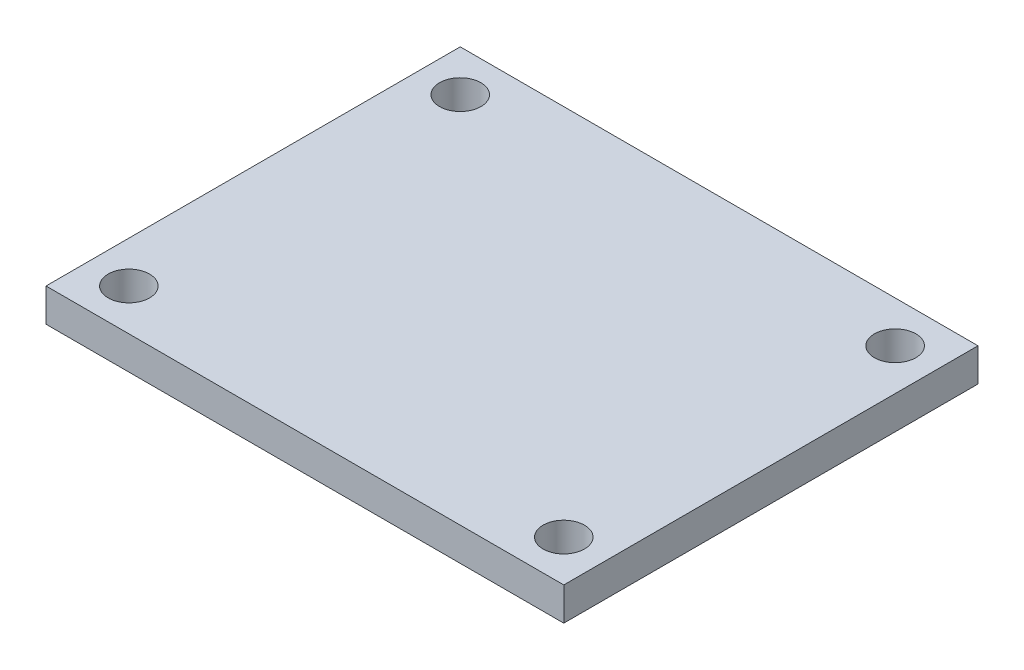
ISO-10303-21;
HEADER;
FILE_DESCRIPTION(('STEP AP214'),'2;1');
FILE_NAME('part.step','',(''),(''),'','','');
FILE_SCHEMA(('AUTOMOTIVE_DESIGN { 1 0 10303 214 1 1 1 1 }'));
ENDSEC;
DATA;
#1=APPLICATION_CONTEXT('core data for automotive mechanical design processes');
#2=APPLICATION_PROTOCOL_DEFINITION('international standard','automotive_design',2000,#1);
#3=PRODUCT_CONTEXT('',#1,'mechanical');
#4=PRODUCT('Part','Part','',(#3));
#5=PRODUCT_RELATED_PRODUCT_CATEGORY('part','',(#4));
#6=PRODUCT_DEFINITION_FORMATION('','',#4);
#7=PRODUCT_DEFINITION_CONTEXT('part definition',#1,'design');
#8=PRODUCT_DEFINITION('design','',#6,#7);
#9=PRODUCT_DEFINITION_SHAPE('','',#8);
#10=(LENGTH_UNIT() NAMED_UNIT(*) SI_UNIT(.MILLI.,.METRE.));
#11=(NAMED_UNIT(*) PLANE_ANGLE_UNIT() SI_UNIT($,.RADIAN.));
#12=(NAMED_UNIT(*) SI_UNIT($,.STERADIAN.) SOLID_ANGLE_UNIT());
#13=UNCERTAINTY_MEASURE_WITH_UNIT(LENGTH_MEASURE(1.E-05),#10,'distance_accuracy_value','');
#14=(GEOMETRIC_REPRESENTATION_CONTEXT(3) GLOBAL_UNCERTAINTY_ASSIGNED_CONTEXT((#13)) GLOBAL_UNIT_ASSIGNED_CONTEXT((#10,
#11,#12)) REPRESENTATION_CONTEXT('',''));
#15=CARTESIAN_POINT('',(0.,0.,0.));
#16=DIRECTION('',(0.,0.,1.));
#17=DIRECTION('',(1.,0.,0.));
#18=AXIS2_PLACEMENT_3D('',#15,#16,#17);
#19=CARTESIAN_POINT('',(-12.5,1.6,-10.));
#20=DIRECTION('',(0.,1.,0.));
#21=DIRECTION('',(0.,0.,1.));
#22=AXIS2_PLACEMENT_3D('',#19,#20,#21);
#23=PLANE('',#22);
#24=CARTESIAN_POINT('',(10.5,1.6,7.99999999999999));
#25=DIRECTION('',(0.,1.,0.));
#26=DIRECTION('',(0.,0.,1.));
#27=AXIS2_PLACEMENT_3D('',#24,#25,#26);
#28=CIRCLE('',#27,1.);
#29=CARTESIAN_POINT('',(10.5,1.6,8.99999999999999));
#30=VERTEX_POINT('',#29);
#31=EDGE_CURVE('E121',#30,#30,#28,.T.);
#32=ORIENTED_EDGE('',*,*,#31,.F.);
#33=EDGE_LOOP('',(#32));
#34=FACE_BOUND('',#33,.T.);
#35=CARTESIAN_POINT('',(-10.5,1.6,-7.99999999999999));
#36=DIRECTION('',(0.,1.,0.));
#37=DIRECTION('',(0.,0.,1.));
#38=AXIS2_PLACEMENT_3D('',#35,#36,#37);
#39=CIRCLE('',#38,1.);
#40=CARTESIAN_POINT('',(-10.5,1.6,-6.99999999999999));
#41=VERTEX_POINT('',#40);
#42=EDGE_CURVE('E100',#41,#41,#39,.T.);
#43=ORIENTED_EDGE('',*,*,#42,.F.);
#44=EDGE_LOOP('',(#43));
#45=FACE_BOUND('',#44,.T.);
#46=DIRECTION('',(0.,0.,1.));
#47=VECTOR('',#46,1.);
#48=CARTESIAN_POINT('',(-12.5,1.6,-10.));
#49=LINE('',#48,#47);
#50=CARTESIAN_POINT('',(-12.5,1.6,-10.));
#51=VERTEX_POINT('',#50);
#52=CARTESIAN_POINT('',(-12.5,1.6,10.));
#53=VERTEX_POINT('',#52);
#54=EDGE_CURVE('E85',#51,#53,#49,.T.);
#55=ORIENTED_EDGE('',*,*,#54,.T.);
#56=DIRECTION('',(1.,0.,0.));
#57=VECTOR('',#56,1.);
#58=CARTESIAN_POINT('',(-12.5,1.6,10.));
#59=LINE('',#58,#57);
#60=CARTESIAN_POINT('',(12.5,1.6,10.));
#61=VERTEX_POINT('',#60);
#62=EDGE_CURVE('E80',#53,#61,#59,.T.);
#63=ORIENTED_EDGE('',*,*,#62,.T.);
#64=DIRECTION('',(0.,0.,-1.));
#65=VECTOR('',#64,1.);
#66=CARTESIAN_POINT('',(12.5,1.6,-10.));
#67=LINE('',#66,#65);
#68=CARTESIAN_POINT('',(12.5,1.6,-10.));
#69=VERTEX_POINT('',#68);
#70=EDGE_CURVE('E83',#61,#69,#67,.T.);
#71=ORIENTED_EDGE('',*,*,#70,.T.);
#72=DIRECTION('',(-1.,0.,0.));
#73=VECTOR('',#72,1.);
#74=CARTESIAN_POINT('',(-12.5,1.6,-10.));
#75=LINE('',#74,#73);
#76=EDGE_CURVE('E50',#69,#51,#75,.T.);
#77=ORIENTED_EDGE('',*,*,#76,.T.);
#78=EDGE_LOOP('',(#55,#63,#71,#77));
#79=FACE_BOUND('',#78,.T.);
#80=CARTESIAN_POINT('',(10.5,1.6,-7.99999999999999));
#81=DIRECTION('',(0.,1.,0.));
#82=DIRECTION('',(0.,0.,-1.));
#83=AXIS2_PLACEMENT_3D('',#80,#81,#82);
#84=CIRCLE('',#83,1.);
#85=CARTESIAN_POINT('',(10.5,1.6,-9.));
#86=VERTEX_POINT('',#85);
#87=EDGE_CURVE('E115',#86,#86,#84,.T.);
#88=ORIENTED_EDGE('',*,*,#87,.F.);
#89=EDGE_LOOP('',(#88));
#90=FACE_BOUND('',#89,.T.);
#91=CARTESIAN_POINT('',(-10.5,1.6,7.99999999999999));
#92=DIRECTION('',(0.,1.,0.));
#93=DIRECTION('',(0.,0.,-1.));
#94=AXIS2_PLACEMENT_3D('',#91,#92,#93);
#95=CIRCLE('',#94,1.);
#96=CARTESIAN_POINT('',(-10.5,1.6,6.99999999999999));
#97=VERTEX_POINT('',#96);
#98=EDGE_CURVE('E127',#97,#97,#95,.T.);
#99=ORIENTED_EDGE('',*,*,#98,.F.);
#100=EDGE_LOOP('',(#99));
#101=FACE_BOUND('',#100,.T.);
#102=ADVANCED_FACE('F33',(#34,#45,#79,#90,#101),#23,.T.);
#103=CARTESIAN_POINT('',(-12.5,0.,-10.));
#104=DIRECTION('',(0.,1.,0.));
#105=DIRECTION('',(0.,0.,1.));
#106=AXIS2_PLACEMENT_3D('',#103,#104,#105);
#107=PLANE('',#106);
#108=CARTESIAN_POINT('',(10.5,0.,7.99999999999999));
#109=DIRECTION('',(0.,1.,0.));
#110=DIRECTION('',(0.,0.,1.));
#111=AXIS2_PLACEMENT_3D('',#108,#109,#110);
#112=CIRCLE('',#111,1.);
#113=CARTESIAN_POINT('',(10.5,0.,8.99999999999999));
#114=VERTEX_POINT('',#113);
#115=EDGE_CURVE('E124',#114,#114,#112,.T.);
#116=ORIENTED_EDGE('',*,*,#115,.T.);
#117=EDGE_LOOP('',(#116));
#118=FACE_BOUND('',#117,.T.);
#119=CARTESIAN_POINT('',(-10.5,0.,-7.99999999999999));
#120=DIRECTION('',(0.,1.,0.));
#121=DIRECTION('',(0.,0.,1.));
#122=AXIS2_PLACEMENT_3D('',#119,#120,#121);
#123=CIRCLE('',#122,1.);
#124=CARTESIAN_POINT('',(-10.5,0.,-6.99999999999999));
#125=VERTEX_POINT('',#124);
#126=EDGE_CURVE('E112',#125,#125,#123,.T.);
#127=ORIENTED_EDGE('',*,*,#126,.T.);
#128=EDGE_LOOP('',(#127));
#129=FACE_BOUND('',#128,.T.);
#130=DIRECTION('',(0.,0.,1.));
#131=VECTOR('',#130,1.);
#132=CARTESIAN_POINT('',(-12.5,0.,-10.));
#133=LINE('',#132,#131);
#134=CARTESIAN_POINT('',(-12.5,0.,-10.));
#135=VERTEX_POINT('',#134);
#136=CARTESIAN_POINT('',(-12.5,0.,10.));
#137=VERTEX_POINT('',#136);
#138=EDGE_CURVE('E97',#135,#137,#133,.T.);
#139=ORIENTED_EDGE('',*,*,#138,.F.);
#140=DIRECTION('',(-1.,0.,0.));
#141=VECTOR('',#140,1.);
#142=CARTESIAN_POINT('',(-12.5,0.,-10.));
#143=LINE('',#142,#141);
#144=CARTESIAN_POINT('',(12.5,0.,-10.));
#145=VERTEX_POINT('',#144);
#146=EDGE_CURVE('E73',#145,#135,#143,.T.);
#147=ORIENTED_EDGE('',*,*,#146,.F.);
#148=DIRECTION('',(0.,0.,-1.));
#149=VECTOR('',#148,1.);
#150=CARTESIAN_POINT('',(12.5,0.,-10.));
#151=LINE('',#150,#149);
#152=CARTESIAN_POINT('',(12.5,0.,10.));
#153=VERTEX_POINT('',#152);
#154=EDGE_CURVE('E67',#153,#145,#151,.T.);
#155=ORIENTED_EDGE('',*,*,#154,.F.);
#156=DIRECTION('',(1.,0.,0.));
#157=VECTOR('',#156,1.);
#158=CARTESIAN_POINT('',(-12.5,0.,10.));
#159=LINE('',#158,#157);
#160=EDGE_CURVE('E89',#137,#153,#159,.T.);
#161=ORIENTED_EDGE('',*,*,#160,.F.);
#162=EDGE_LOOP('',(#139,#147,#155,#161));
#163=FACE_BOUND('',#162,.T.);
#164=CARTESIAN_POINT('',(10.5,0.,-7.99999999999999));
#165=DIRECTION('',(0.,1.,0.));
#166=DIRECTION('',(0.,0.,-1.));
#167=AXIS2_PLACEMENT_3D('',#164,#165,#166);
#168=CIRCLE('',#167,1.);
#169=CARTESIAN_POINT('',(10.5,0.,-9.));
#170=VERTEX_POINT('',#169);
#171=EDGE_CURVE('E118',#170,#170,#168,.T.);
#172=ORIENTED_EDGE('',*,*,#171,.T.);
#173=EDGE_LOOP('',(#172));
#174=FACE_BOUND('',#173,.T.);
#175=CARTESIAN_POINT('',(-10.5,0.,7.99999999999999));
#176=DIRECTION('',(0.,1.,0.));
#177=DIRECTION('',(0.,0.,-1.));
#178=AXIS2_PLACEMENT_3D('',#175,#176,#177);
#179=CIRCLE('',#178,1.);
#180=CARTESIAN_POINT('',(-10.5,0.,6.99999999999999));
#181=VERTEX_POINT('',#180);
#182=EDGE_CURVE('E130',#181,#181,#179,.T.);
#183=ORIENTED_EDGE('',*,*,#182,.T.);
#184=EDGE_LOOP('',(#183));
#185=FACE_BOUND('',#184,.T.);
#186=ADVANCED_FACE('F108',(#118,#129,#163,#174,#185),#107,.F.);
#187=CARTESIAN_POINT('',(-12.5,1.6,-10.));
#188=DIRECTION('',(1.,0.,0.));
#189=DIRECTION('',(0.,0.,-1.));
#190=AXIS2_PLACEMENT_3D('',#187,#188,#189);
#191=PLANE('',#190);
#192=ORIENTED_EDGE('',*,*,#138,.T.);
#193=DIRECTION('',(0.,-1.,0.));
#194=VECTOR('',#193,1.);
#195=CARTESIAN_POINT('',(-12.5,1.6,10.));
#196=LINE('',#195,#194);
#197=EDGE_CURVE('E11',#53,#137,#196,.T.);
#198=ORIENTED_EDGE('',*,*,#197,.F.);
#199=ORIENTED_EDGE('',*,*,#54,.F.);
#200=DIRECTION('',(0.,-1.,0.));
#201=VECTOR('',#200,1.);
#202=CARTESIAN_POINT('',(-12.5,1.6,-10.));
#203=LINE('',#202,#201);
#204=EDGE_CURVE('E93',#51,#135,#203,.T.);
#205=ORIENTED_EDGE('',*,*,#204,.T.);
#206=EDGE_LOOP('',(#192,#198,#199,#205));
#207=FACE_BOUND('',#206,.T.);
#208=ADVANCED_FACE('F35',(#207),#191,.F.);
#209=CARTESIAN_POINT('',(-12.5,1.6,10.));
#210=DIRECTION('',(0.,0.,-1.));
#211=DIRECTION('',(-1.,0.,0.));
#212=AXIS2_PLACEMENT_3D('',#209,#210,#211);
#213=PLANE('',#212);
#214=ORIENTED_EDGE('',*,*,#160,.T.);
#215=DIRECTION('',(0.,-1.,0.));
#216=VECTOR('',#215,1.);
#217=CARTESIAN_POINT('',(12.5,1.6,10.));
#218=LINE('',#217,#216);
#219=EDGE_CURVE('E42',#61,#153,#218,.T.);
#220=ORIENTED_EDGE('',*,*,#219,.F.);
#221=ORIENTED_EDGE('',*,*,#62,.F.);
#222=ORIENTED_EDGE('',*,*,#197,.T.);
#223=EDGE_LOOP('',(#214,#220,#221,#222));
#224=FACE_BOUND('',#223,.T.);
#225=ADVANCED_FACE('F88',(#224),#213,.F.);
#226=CARTESIAN_POINT('',(12.5,1.6,-10.));
#227=DIRECTION('',(-1.,0.,0.));
#228=DIRECTION('',(0.,0.,1.));
#229=AXIS2_PLACEMENT_3D('',#226,#227,#228);
#230=PLANE('',#229);
#231=ORIENTED_EDGE('',*,*,#154,.T.);
#232=DIRECTION('',(0.,-1.,0.));
#233=VECTOR('',#232,1.);
#234=CARTESIAN_POINT('',(12.5,1.6,-10.));
#235=LINE('',#234,#233);
#236=EDGE_CURVE('E90',#69,#145,#235,.T.);
#237=ORIENTED_EDGE('',*,*,#236,.F.);
#238=ORIENTED_EDGE('',*,*,#70,.F.);
#239=ORIENTED_EDGE('',*,*,#219,.T.);
#240=EDGE_LOOP('',(#231,#237,#238,#239));
#241=FACE_BOUND('',#240,.T.);
#242=ADVANCED_FACE('F91',(#241),#230,.F.);
#243=CARTESIAN_POINT('',(-12.5,1.6,-10.));
#244=DIRECTION('',(0.,0.,1.));
#245=DIRECTION('',(1.,0.,0.));
#246=AXIS2_PLACEMENT_3D('',#243,#244,#245);
#247=PLANE('',#246);
#248=ORIENTED_EDGE('',*,*,#146,.T.);
#249=ORIENTED_EDGE('',*,*,#204,.F.);
#250=ORIENTED_EDGE('',*,*,#76,.F.);
#251=ORIENTED_EDGE('',*,*,#236,.T.);
#252=EDGE_LOOP('',(#248,#249,#250,#251));
#253=FACE_BOUND('',#252,.T.);
#254=ADVANCED_FACE('F105',(#253),#247,.F.);
#255=CARTESIAN_POINT('',(-10.5,1.6,-7.99999999999999));
#256=DIRECTION('',(0.,-1.,0.));
#257=DIRECTION('',(0.,0.,-1.));
#258=AXIS2_PLACEMENT_3D('',#255,#256,#257);
#259=CYLINDRICAL_SURFACE('',#258,1.);
#260=ORIENTED_EDGE('',*,*,#42,.T.);
#261=EDGE_LOOP('',(#260));
#262=FACE_BOUND('',#261,.T.);
#263=ORIENTED_EDGE('',*,*,#126,.F.);
#264=EDGE_LOOP('',(#263));
#265=FACE_BOUND('',#264,.T.);
#266=ADVANCED_FACE('F150',(#262,#265),#259,.F.);
#267=CARTESIAN_POINT('',(10.5,1.6,-7.99999999999999));
#268=DIRECTION('',(0.,-1.,0.));
#269=DIRECTION('',(0.,0.,-1.));
#270=AXIS2_PLACEMENT_3D('',#267,#268,#269);
#271=CYLINDRICAL_SURFACE('',#270,1.);
#272=ORIENTED_EDGE('',*,*,#87,.T.);
#273=EDGE_LOOP('',(#272));
#274=FACE_BOUND('',#273,.T.);
#275=ORIENTED_EDGE('',*,*,#171,.F.);
#276=EDGE_LOOP('',(#275));
#277=FACE_BOUND('',#276,.T.);
#278=ADVANCED_FACE('F196',(#274,#277),#271,.F.);
#279=CARTESIAN_POINT('',(10.5,1.6,7.99999999999999));
#280=DIRECTION('',(0.,-1.,0.));
#281=DIRECTION('',(0.,0.,-1.));
#282=AXIS2_PLACEMENT_3D('',#279,#280,#281);
#283=CYLINDRICAL_SURFACE('',#282,1.);
#284=ORIENTED_EDGE('',*,*,#31,.T.);
#285=EDGE_LOOP('',(#284));
#286=FACE_BOUND('',#285,.T.);
#287=ORIENTED_EDGE('',*,*,#115,.F.);
#288=EDGE_LOOP('',(#287));
#289=FACE_BOUND('',#288,.T.);
#290=ADVANCED_FACE('F204',(#286,#289),#283,.F.);
#291=CARTESIAN_POINT('',(-10.5,1.6,7.99999999999999));
#292=DIRECTION('',(0.,-1.,0.));
#293=DIRECTION('',(0.,0.,-1.));
#294=AXIS2_PLACEMENT_3D('',#291,#292,#293);
#295=CYLINDRICAL_SURFACE('',#294,1.);
#296=ORIENTED_EDGE('',*,*,#98,.T.);
#297=EDGE_LOOP('',(#296));
#298=FACE_BOUND('',#297,.T.);
#299=ORIENTED_EDGE('',*,*,#182,.F.);
#300=EDGE_LOOP('',(#299));
#301=FACE_BOUND('',#300,.T.);
#302=ADVANCED_FACE('F136',(#298,#301),#295,.F.);
#303=CLOSED_SHELL('',(#102,#186,#208,#225,#242,#254,#266,#278,#290,#302));
#304=MANIFOLD_SOLID_BREP('B2',#303);
#305=ADVANCED_BREP_SHAPE_REPRESENTATION('',(#18,#304),#14);
#306=SHAPE_DEFINITION_REPRESENTATION(#9,#305);
ENDSEC;
END-ISO-10303-21;
